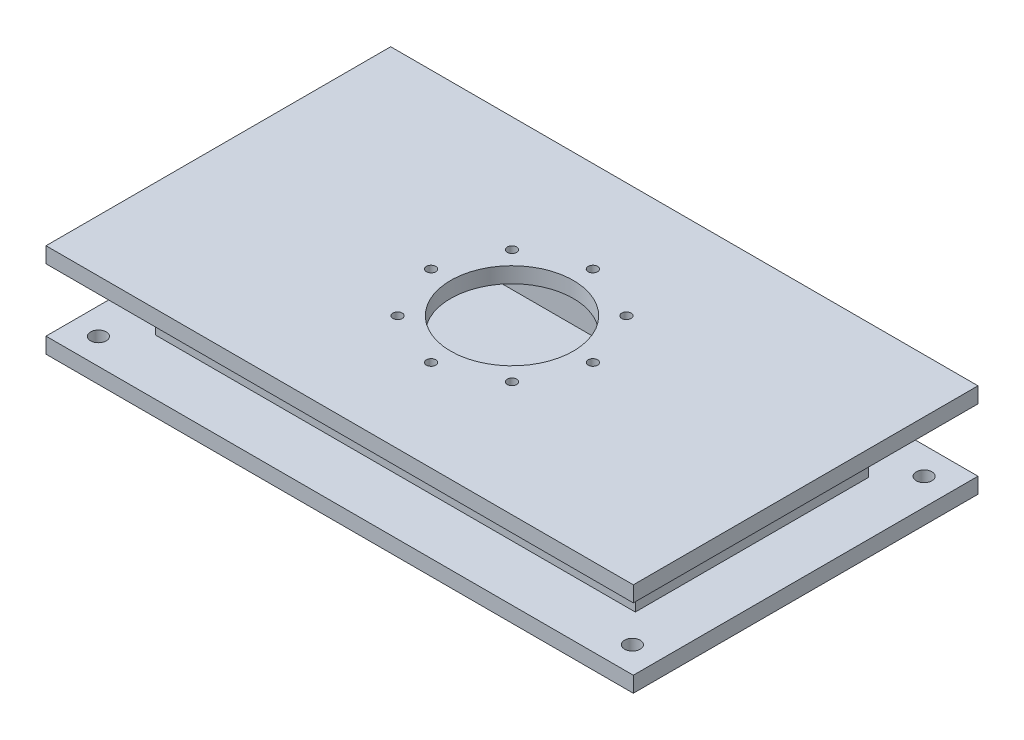
ISO-10303-21;
HEADER;
FILE_DESCRIPTION(('STEP AP214'),'2;1');
FILE_NAME('part.step','',(''),(''),'','','');
FILE_SCHEMA(('AUTOMOTIVE_DESIGN { 1 0 10303 214 1 1 1 1 }'));
ENDSEC;
DATA;
#1=APPLICATION_CONTEXT('core data for automotive mechanical design processes');
#2=APPLICATION_PROTOCOL_DEFINITION('international standard','automotive_design',2000,#1);
#3=PRODUCT_CONTEXT('',#1,'mechanical');
#4=PRODUCT('Part','Part','',(#3));
#5=PRODUCT_RELATED_PRODUCT_CATEGORY('part','',(#4));
#6=PRODUCT_DEFINITION_FORMATION('','',#4);
#7=PRODUCT_DEFINITION_CONTEXT('part definition',#1,'design');
#8=PRODUCT_DEFINITION('design','',#6,#7);
#9=PRODUCT_DEFINITION_SHAPE('','',#8);
#10=(LENGTH_UNIT() NAMED_UNIT(*) SI_UNIT(.MILLI.,.METRE.));
#11=(NAMED_UNIT(*) PLANE_ANGLE_UNIT() SI_UNIT($,.RADIAN.));
#12=(NAMED_UNIT(*) SI_UNIT($,.STERADIAN.) SOLID_ANGLE_UNIT());
#13=UNCERTAINTY_MEASURE_WITH_UNIT(LENGTH_MEASURE(1.E-05),#10,'distance_accuracy_value','');
#14=(GEOMETRIC_REPRESENTATION_CONTEXT(3) GLOBAL_UNCERTAINTY_ASSIGNED_CONTEXT((#13)) GLOBAL_UNIT_ASSIGNED_CONTEXT((#10,
#11,#12)) REPRESENTATION_CONTEXT('',''));
#15=CARTESIAN_POINT('',(0.,0.,0.));
#16=DIRECTION('',(0.,0.,1.));
#17=DIRECTION('',(1.,0.,0.));
#18=AXIS2_PLACEMENT_3D('',#15,#16,#17);
#19=CARTESIAN_POINT('',(0.,3.,0.));
#20=DIRECTION('',(0.,1.,0.));
#21=DIRECTION('',(0.,0.,1.));
#22=AXIS2_PLACEMENT_3D('',#19,#20,#21);
#23=PLANE('',#22);
#24=DIRECTION('',(0.,0.,1.));
#25=VECTOR('',#24,1.);
#26=CARTESIAN_POINT('',(-40.9820167865707,3.,-15.236345323741));
#27=LINE('',#26,#25);
#28=CARTESIAN_POINT('',(-40.9820167865707,3.,-15.236345323741));
#29=VERTEX_POINT('',#28);
#30=CARTESIAN_POINT('',(-40.9820167865707,3.,29.467654676259));
#31=VERTEX_POINT('',#30);
#32=EDGE_CURVE('E57',#29,#31,#27,.T.);
#33=ORIENTED_EDGE('',*,*,#32,.F.);
#34=DIRECTION('',(1.,0.,0.));
#35=VECTOR('',#34,1.);
#36=CARTESIAN_POINT('',(-40.9820167865707,3.,-15.236345323741));
#37=LINE('',#36,#35);
#38=CARTESIAN_POINT('',(50.9659832134293,3.,-15.236345323741));
#39=VERTEX_POINT('',#38);
#40=EDGE_CURVE('E64',#29,#39,#37,.T.);
#41=ORIENTED_EDGE('',*,*,#40,.T.);
#42=DIRECTION('',(0.,0.,1.));
#43=VECTOR('',#42,1.);
#44=CARTESIAN_POINT('',(50.9659832134293,3.,-15.236345323741));
#45=LINE('',#44,#43);
#46=CARTESIAN_POINT('',(50.9659832134293,3.,29.467654676259));
#47=VERTEX_POINT('',#46);
#48=EDGE_CURVE('E239',#39,#47,#45,.T.);
#49=ORIENTED_EDGE('',*,*,#48,.T.);
#50=DIRECTION('',(1.,0.,0.));
#51=VECTOR('',#50,1.);
#52=CARTESIAN_POINT('',(-40.9820167865707,3.,29.467654676259));
#53=LINE('',#52,#51);
#54=EDGE_CURVE('E237',#31,#47,#53,.T.);
#55=ORIENTED_EDGE('',*,*,#54,.F.);
#56=EDGE_LOOP('',(#33,#41,#49,#55));
#57=FACE_BOUND('',#56,.T.);
#58=CARTESIAN_POINT('',(56.1003672610243,3.,-20.7265189265204));
#59=DIRECTION('',(0.,1.,0.));
#60=DIRECTION('',(0.,0.,1.));
#61=AXIS2_PLACEMENT_3D('',#58,#59,#60);
#62=CIRCLE('',#61,1.5);
#63=CARTESIAN_POINT('',(56.1003672610243,3.,-19.2265189265204));
#64=VERTEX_POINT('',#63);
#65=EDGE_CURVE('E256',#64,#64,#62,.T.);
#66=ORIENTED_EDGE('',*,*,#65,.F.);
#67=EDGE_LOOP('',(#66));
#68=FACE_BOUND('',#67,.T.);
#69=CARTESIAN_POINT('',(-46.2077417648702,3.,-20.7265189265204));
#70=DIRECTION('',(0.,1.,0.));
#71=DIRECTION('',(0.,0.,1.));
#72=AXIS2_PLACEMENT_3D('',#69,#70,#71);
#73=CIRCLE('',#72,1.5);
#74=CARTESIAN_POINT('',(-46.2077417648702,3.,-19.2265189265204));
#75=VERTEX_POINT('',#74);
#76=EDGE_CURVE('E269',#75,#75,#73,.T.);
#77=ORIENTED_EDGE('',*,*,#76,.F.);
#78=EDGE_LOOP('',(#77));
#79=FACE_BOUND('',#78,.T.);
#80=DIRECTION('',(0.,0.,1.));
#81=VECTOR('',#80,1.);
#82=CARTESIAN_POINT('',(-51.2690167865707,3.,-25.904345323741));
#83=LINE('',#82,#81);
#84=CARTESIAN_POINT('',(-51.2690167865707,3.,-25.904345323741));
#85=VERTEX_POINT('',#84);
#86=CARTESIAN_POINT('',(-51.2690167865707,3.,40.135654676259));
#87=VERTEX_POINT('',#86);
#88=EDGE_CURVE('E277',#85,#87,#83,.T.);
#89=ORIENTED_EDGE('',*,*,#88,.T.);
#90=DIRECTION('',(1.,0.,0.));
#91=VECTOR('',#90,1.);
#92=CARTESIAN_POINT('',(-51.2690167865707,3.,40.135654676259));
#93=LINE('',#92,#91);
#94=CARTESIAN_POINT('',(61.2529832134293,3.,40.135654676259));
#95=VERTEX_POINT('',#94);
#96=EDGE_CURVE('E276',#87,#95,#93,.T.);
#97=ORIENTED_EDGE('',*,*,#96,.T.);
#98=DIRECTION('',(0.,0.,-1.));
#99=VECTOR('',#98,1.);
#100=CARTESIAN_POINT('',(61.2529832134293,3.,-25.904345323741));
#101=LINE('',#100,#99);
#102=CARTESIAN_POINT('',(61.2529832134293,3.,-25.904345323741));
#103=VERTEX_POINT('',#102);
#104=EDGE_CURVE('E281',#95,#103,#101,.T.);
#105=ORIENTED_EDGE('',*,*,#104,.T.);
#106=DIRECTION('',(-1.,0.,0.));
#107=VECTOR('',#106,1.);
#108=CARTESIAN_POINT('',(-51.2690167865707,3.,-25.904345323741));
#109=LINE('',#108,#107);
#110=EDGE_CURVE('E283',#103,#85,#109,.T.);
#111=ORIENTED_EDGE('',*,*,#110,.T.);
#112=EDGE_LOOP('',(#89,#97,#105,#111));
#113=FACE_BOUND('',#112,.T.);
#114=CARTESIAN_POINT('',(56.1003672610243,3.,35.1559236985098));
#115=DIRECTION('',(0.,1.,0.));
#116=DIRECTION('',(0.,0.,1.));
#117=AXIS2_PLACEMENT_3D('',#114,#115,#116);
#118=CIRCLE('',#117,1.5);
#119=CARTESIAN_POINT('',(56.1003672610243,3.,36.6559236985098));
#120=VERTEX_POINT('',#119);
#121=EDGE_CURVE('E262',#120,#120,#118,.T.);
#122=ORIENTED_EDGE('',*,*,#121,.F.);
#123=EDGE_LOOP('',(#122));
#124=FACE_BOUND('',#123,.T.);
#125=CARTESIAN_POINT('',(-46.2077417648702,3.,35.1559236985098));
#126=DIRECTION('',(0.,1.,0.));
#127=DIRECTION('',(0.,0.,1.));
#128=AXIS2_PLACEMENT_3D('',#125,#126,#127);
#129=CIRCLE('',#128,1.5);
#130=CARTESIAN_POINT('',(-46.2077417648702,3.,36.6559236985098));
#131=VERTEX_POINT('',#130);
#132=EDGE_CURVE('E252',#131,#131,#129,.T.);
#133=ORIENTED_EDGE('',*,*,#132,.F.);
#134=EDGE_LOOP('',(#133));
#135=FACE_BOUND('',#134,.T.);
#136=ADVANCED_FACE('F39',(#57,#68,#79,#113,#124,#135),#23,.T.);
#137=CARTESIAN_POINT('',(0.,0.,0.));
#138=DIRECTION('',(0.,1.,0.));
#139=DIRECTION('',(0.,0.,1.));
#140=AXIS2_PLACEMENT_3D('',#137,#138,#139);
#141=PLANE('',#140);
#142=DIRECTION('',(0.,0.,1.));
#143=VECTOR('',#142,1.);
#144=CARTESIAN_POINT('',(-51.2690167865707,0.,-25.904345323741));
#145=LINE('',#144,#143);
#146=CARTESIAN_POINT('',(-51.2690167865707,0.,-25.904345323741));
#147=VERTEX_POINT('',#146);
#148=CARTESIAN_POINT('',(-51.2690167865707,0.,40.135654676259));
#149=VERTEX_POINT('',#148);
#150=EDGE_CURVE('E272',#147,#149,#145,.T.);
#151=ORIENTED_EDGE('',*,*,#150,.F.);
#152=DIRECTION('',(-1.,0.,0.));
#153=VECTOR('',#152,1.);
#154=CARTESIAN_POINT('',(-51.2690167865707,0.,-25.904345323741));
#155=LINE('',#154,#153);
#156=CARTESIAN_POINT('',(61.2529832134293,0.,-25.904345323741));
#157=VERTEX_POINT('',#156);
#158=EDGE_CURVE('E278',#157,#147,#155,.T.);
#159=ORIENTED_EDGE('',*,*,#158,.F.);
#160=DIRECTION('',(0.,0.,-1.));
#161=VECTOR('',#160,1.);
#162=CARTESIAN_POINT('',(61.2529832134293,0.,-25.904345323741));
#163=LINE('',#162,#161);
#164=CARTESIAN_POINT('',(61.2529832134293,0.,40.135654676259));
#165=VERTEX_POINT('',#164);
#166=EDGE_CURVE('E292',#165,#157,#163,.T.);
#167=ORIENTED_EDGE('',*,*,#166,.F.);
#168=DIRECTION('',(1.,0.,0.));
#169=VECTOR('',#168,1.);
#170=CARTESIAN_POINT('',(-51.2690167865707,0.,40.135654676259));
#171=LINE('',#170,#169);
#172=EDGE_CURVE('E289',#149,#165,#171,.T.);
#173=ORIENTED_EDGE('',*,*,#172,.F.);
#174=EDGE_LOOP('',(#151,#159,#167,#173));
#175=FACE_BOUND('',#174,.T.);
#176=CARTESIAN_POINT('',(-46.2077417648702,0.,-20.7265189265204));
#177=DIRECTION('',(0.,1.,0.));
#178=DIRECTION('',(0.,0.,1.));
#179=AXIS2_PLACEMENT_3D('',#176,#177,#178);
#180=CIRCLE('',#179,1.5);
#181=CARTESIAN_POINT('',(-46.2077417648702,0.,-19.2265189265204));
#182=VERTEX_POINT('',#181);
#183=EDGE_CURVE('E270',#182,#182,#180,.T.);
#184=ORIENTED_EDGE('',*,*,#183,.T.);
#185=EDGE_LOOP('',(#184));
#186=FACE_BOUND('',#185,.T.);
#187=CARTESIAN_POINT('',(56.1003672610243,0.,35.1559236985098));
#188=DIRECTION('',(0.,1.,0.));
#189=DIRECTION('',(0.,0.,1.));
#190=AXIS2_PLACEMENT_3D('',#187,#188,#189);
#191=CIRCLE('',#190,1.5);
#192=CARTESIAN_POINT('',(56.1003672610243,0.,36.6559236985098));
#193=VERTEX_POINT('',#192);
#194=EDGE_CURVE('E261',#193,#193,#191,.T.);
#195=ORIENTED_EDGE('',*,*,#194,.T.);
#196=EDGE_LOOP('',(#195));
#197=FACE_BOUND('',#196,.T.);
#198=CARTESIAN_POINT('',(56.1003672610243,0.,-20.7265189265204));
#199=DIRECTION('',(0.,1.,0.));
#200=DIRECTION('',(0.,0.,1.));
#201=AXIS2_PLACEMENT_3D('',#198,#199,#200);
#202=CIRCLE('',#201,1.5);
#203=CARTESIAN_POINT('',(56.1003672610243,0.,-19.2265189265204));
#204=VERTEX_POINT('',#203);
#205=EDGE_CURVE('E254',#204,#204,#202,.T.);
#206=ORIENTED_EDGE('',*,*,#205,.T.);
#207=EDGE_LOOP('',(#206));
#208=FACE_BOUND('',#207,.T.);
#209=CARTESIAN_POINT('',(-46.2077417648702,0.,35.1559236985098));
#210=DIRECTION('',(0.,1.,0.));
#211=DIRECTION('',(0.,0.,1.));
#212=AXIS2_PLACEMENT_3D('',#209,#210,#211);
#213=CIRCLE('',#212,1.5);
#214=CARTESIAN_POINT('',(-46.2077417648702,0.,36.6559236985098));
#215=VERTEX_POINT('',#214);
#216=EDGE_CURVE('E253',#215,#215,#213,.T.);
#217=ORIENTED_EDGE('',*,*,#216,.T.);
#218=EDGE_LOOP('',(#217));
#219=FACE_BOUND('',#218,.T.);
#220=ADVANCED_FACE('F337',(#175,#186,#197,#208,#219),#141,.F.);
#221=CARTESIAN_POINT('',(-51.2690167865707,3.,-25.904345323741));
#222=DIRECTION('',(1.,0.,0.));
#223=DIRECTION('',(0.,0.,-1.));
#224=AXIS2_PLACEMENT_3D('',#221,#222,#223);
#225=PLANE('',#224);
#226=ORIENTED_EDGE('',*,*,#150,.T.);
#227=DIRECTION('',(0.,-1.,0.));
#228=VECTOR('',#227,1.);
#229=CARTESIAN_POINT('',(-51.2690167865707,3.,40.135654676259));
#230=LINE('',#229,#228);
#231=EDGE_CURVE('E11',#87,#149,#230,.T.);
#232=ORIENTED_EDGE('',*,*,#231,.F.);
#233=ORIENTED_EDGE('',*,*,#88,.F.);
#234=DIRECTION('',(0.,-1.,0.));
#235=VECTOR('',#234,1.);
#236=CARTESIAN_POINT('',(-51.2690167865707,3.,-25.904345323741));
#237=LINE('',#236,#235);
#238=EDGE_CURVE('E287',#85,#147,#237,.T.);
#239=ORIENTED_EDGE('',*,*,#238,.T.);
#240=EDGE_LOOP('',(#226,#232,#233,#239));
#241=FACE_BOUND('',#240,.T.);
#242=ADVANCED_FACE('F41',(#241),#225,.F.);
#243=CARTESIAN_POINT('',(-51.2690167865707,3.,40.135654676259));
#244=DIRECTION('',(0.,0.,-1.));
#245=DIRECTION('',(-1.,0.,0.));
#246=AXIS2_PLACEMENT_3D('',#243,#244,#245);
#247=PLANE('',#246);
#248=ORIENTED_EDGE('',*,*,#172,.T.);
#249=DIRECTION('',(0.,-1.,0.));
#250=VECTOR('',#249,1.);
#251=CARTESIAN_POINT('',(61.2529832134293,3.,40.135654676259));
#252=LINE('',#251,#250);
#253=EDGE_CURVE('E48',#95,#165,#252,.T.);
#254=ORIENTED_EDGE('',*,*,#253,.F.);
#255=ORIENTED_EDGE('',*,*,#96,.F.);
#256=ORIENTED_EDGE('',*,*,#231,.T.);
#257=EDGE_LOOP('',(#248,#254,#255,#256));
#258=FACE_BOUND('',#257,.T.);
#259=ADVANCED_FACE('F356',(#258),#247,.F.);
#260=CARTESIAN_POINT('',(61.2529832134293,3.,-25.904345323741));
#261=DIRECTION('',(-1.,0.,0.));
#262=DIRECTION('',(0.,0.,1.));
#263=AXIS2_PLACEMENT_3D('',#260,#261,#262);
#264=PLANE('',#263);
#265=ORIENTED_EDGE('',*,*,#166,.T.);
#266=DIRECTION('',(0.,-1.,0.));
#267=VECTOR('',#266,1.);
#268=CARTESIAN_POINT('',(61.2529832134293,3.,-25.904345323741));
#269=LINE('',#268,#267);
#270=EDGE_CURVE('E299',#103,#157,#269,.T.);
#271=ORIENTED_EDGE('',*,*,#270,.F.);
#272=ORIENTED_EDGE('',*,*,#104,.F.);
#273=ORIENTED_EDGE('',*,*,#253,.T.);
#274=EDGE_LOOP('',(#265,#271,#272,#273));
#275=FACE_BOUND('',#274,.T.);
#276=ADVANCED_FACE('F360',(#275),#264,.F.);
#277=CARTESIAN_POINT('',(-51.2690167865707,3.,-25.904345323741));
#278=DIRECTION('',(0.,0.,1.));
#279=DIRECTION('',(1.,0.,0.));
#280=AXIS2_PLACEMENT_3D('',#277,#278,#279);
#281=PLANE('',#280);
#282=ORIENTED_EDGE('',*,*,#158,.T.);
#283=ORIENTED_EDGE('',*,*,#238,.F.);
#284=ORIENTED_EDGE('',*,*,#110,.F.);
#285=ORIENTED_EDGE('',*,*,#270,.T.);
#286=EDGE_LOOP('',(#282,#283,#284,#285));
#287=FACE_BOUND('',#286,.T.);
#288=ADVANCED_FACE('F353',(#287),#281,.F.);
#289=CARTESIAN_POINT('',(-46.2077417648702,3.,-20.7265189265204));
#290=DIRECTION('',(0.,-1.,0.));
#291=DIRECTION('',(0.,0.,-1.));
#292=AXIS2_PLACEMENT_3D('',#289,#290,#291);
#293=CYLINDRICAL_SURFACE('',#292,1.5);
#294=ORIENTED_EDGE('',*,*,#76,.T.);
#295=EDGE_LOOP('',(#294));
#296=FACE_BOUND('',#295,.T.);
#297=ORIENTED_EDGE('',*,*,#183,.F.);
#298=EDGE_LOOP('',(#297));
#299=FACE_BOUND('',#298,.T.);
#300=ADVANCED_FACE('F354',(#296,#299),#293,.F.);
#301=CARTESIAN_POINT('',(56.1003672610243,3.,35.1559236985098));
#302=DIRECTION('',(0.,-1.,0.));
#303=DIRECTION('',(0.,0.,-1.));
#304=AXIS2_PLACEMENT_3D('',#301,#302,#303);
#305=CYLINDRICAL_SURFACE('',#304,1.5);
#306=ORIENTED_EDGE('',*,*,#121,.T.);
#307=EDGE_LOOP('',(#306));
#308=FACE_BOUND('',#307,.T.);
#309=ORIENTED_EDGE('',*,*,#194,.F.);
#310=EDGE_LOOP('',(#309));
#311=FACE_BOUND('',#310,.T.);
#312=ADVANCED_FACE('F399',(#308,#311),#305,.F.);
#313=CARTESIAN_POINT('',(56.1003672610243,3.,-20.7265189265204));
#314=DIRECTION('',(0.,-1.,0.));
#315=DIRECTION('',(0.,0.,-1.));
#316=AXIS2_PLACEMENT_3D('',#313,#314,#315);
#317=CYLINDRICAL_SURFACE('',#316,1.5);
#318=ORIENTED_EDGE('',*,*,#65,.T.);
#319=EDGE_LOOP('',(#318));
#320=FACE_BOUND('',#319,.T.);
#321=ORIENTED_EDGE('',*,*,#205,.F.);
#322=EDGE_LOOP('',(#321));
#323=FACE_BOUND('',#322,.T.);
#324=ADVANCED_FACE('F389',(#320,#323),#317,.F.);
#325=CARTESIAN_POINT('',(-46.2077417648702,3.,35.1559236985098));
#326=DIRECTION('',(0.,-1.,0.));
#327=DIRECTION('',(0.,0.,-1.));
#328=AXIS2_PLACEMENT_3D('',#325,#326,#327);
#329=CYLINDRICAL_SURFACE('',#328,1.5);
#330=ORIENTED_EDGE('',*,*,#132,.T.);
#331=EDGE_LOOP('',(#330));
#332=FACE_BOUND('',#331,.T.);
#333=ORIENTED_EDGE('',*,*,#216,.F.);
#334=EDGE_LOOP('',(#333));
#335=FACE_BOUND('',#334,.T.);
#336=ADVANCED_FACE('F384',(#332,#335),#329,.F.);
#337=CARTESIAN_POINT('',(-40.9820167865707,15.,-15.236345323741));
#338=DIRECTION('',(1.,0.,0.));
#339=DIRECTION('',(0.,0.,-1.));
#340=AXIS2_PLACEMENT_3D('',#337,#338,#339);
#341=PLANE('',#340);
#342=CARTESIAN_POINT('',(-40.9820167865707,8.19742761136061,-6.69341202867461));
#343=DIRECTION('',(-1.,0.,0.));
#344=DIRECTION('',(0.,0.,1.));
#345=AXIS2_PLACEMENT_3D('',#342,#343,#344);
#346=CIRCLE('',#345,3.39382923358218);
#347=CARTESIAN_POINT('',(-40.9820167865707,8.19742761136061,-3.29958279509243));
#348=VERTEX_POINT('',#347);
#349=EDGE_CURVE('E179',#348,#348,#346,.T.);
#350=ORIENTED_EDGE('',*,*,#349,.F.);
#351=EDGE_LOOP('',(#350));
#352=FACE_BOUND('',#351,.T.);
#353=ORIENTED_EDGE('',*,*,#32,.T.);
#354=DIRECTION('',(0.,-1.,0.));
#355=VECTOR('',#354,1.);
#356=CARTESIAN_POINT('',(-40.9820167865707,15.,29.467654676259));
#357=LINE('',#356,#355);
#358=CARTESIAN_POINT('',(-40.9820167865707,15.,29.467654676259));
#359=VERTEX_POINT('',#358);
#360=EDGE_CURVE('E248',#359,#31,#357,.T.);
#361=ORIENTED_EDGE('',*,*,#360,.F.);
#362=DIRECTION('',(0.,0.,1.));
#363=VECTOR('',#362,1.);
#364=CARTESIAN_POINT('',(-40.9820167865707,15.,-15.236345323741));
#365=LINE('',#364,#363);
#366=CARTESIAN_POINT('',(-40.9820167865707,15.,-15.236345323741));
#367=VERTEX_POINT('',#366);
#368=EDGE_CURVE('E221',#367,#359,#365,.T.);
#369=ORIENTED_EDGE('',*,*,#368,.F.);
#370=DIRECTION('',(0.,-1.,0.));
#371=VECTOR('',#370,1.);
#372=CARTESIAN_POINT('',(-40.9820167865707,15.,-15.236345323741));
#373=LINE('',#372,#371);
#374=EDGE_CURVE('E234',#367,#29,#373,.T.);
#375=ORIENTED_EDGE('',*,*,#374,.T.);
#376=EDGE_LOOP('',(#353,#361,#369,#375));
#377=FACE_BOUND('',#376,.T.);
#378=ADVANCED_FACE('F390',(#352,#377),#341,.F.);
#379=CARTESIAN_POINT('',(-40.9820167865707,15.,29.467654676259));
#380=DIRECTION('',(0.,0.,-1.));
#381=DIRECTION('',(-1.,0.,0.));
#382=AXIS2_PLACEMENT_3D('',#379,#380,#381);
#383=PLANE('',#382);
#384=CARTESIAN_POINT('',(-28.8927842475601,9.11852717828765,29.467654676259));
#385=DIRECTION('',(0.,0.,1.));
#386=DIRECTION('',(1.,0.,0.));
#387=AXIS2_PLACEMENT_3D('',#384,#385,#386);
#388=CIRCLE('',#387,3.25340658543422);
#389=CARTESIAN_POINT('',(-25.6393776621259,9.11852717828765,29.467654676259));
#390=VERTEX_POINT('',#389);
#391=EDGE_CURVE('E186',#390,#390,#388,.T.);
#392=ORIENTED_EDGE('',*,*,#391,.F.);
#393=EDGE_LOOP('',(#392));
#394=FACE_BOUND('',#393,.T.);
#395=ORIENTED_EDGE('',*,*,#54,.T.);
#396=DIRECTION('',(0.,-1.,0.));
#397=VECTOR('',#396,1.);
#398=CARTESIAN_POINT('',(50.9659832134293,15.,29.467654676259));
#399=LINE('',#398,#397);
#400=CARTESIAN_POINT('',(50.9659832134293,15.,29.467654676259));
#401=VERTEX_POINT('',#400);
#402=EDGE_CURVE('E242',#401,#47,#399,.T.);
#403=ORIENTED_EDGE('',*,*,#402,.F.);
#404=DIRECTION('',(1.,0.,0.));
#405=VECTOR('',#404,1.);
#406=CARTESIAN_POINT('',(-40.9820167865707,15.,29.467654676259));
#407=LINE('',#406,#405);
#408=EDGE_CURVE('E229',#359,#401,#407,.T.);
#409=ORIENTED_EDGE('',*,*,#408,.F.);
#410=ORIENTED_EDGE('',*,*,#360,.T.);
#411=EDGE_LOOP('',(#395,#403,#409,#410));
#412=FACE_BOUND('',#411,.T.);
#413=ADVANCED_FACE('F397',(#394,#412),#383,.F.);
#414=CARTESIAN_POINT('',(50.9659832134293,15.,-15.236345323741));
#415=DIRECTION('',(1.,0.,0.));
#416=DIRECTION('',(0.,0.,-1.));
#417=AXIS2_PLACEMENT_3D('',#414,#415,#416);
#418=PLANE('',#417);
#419=ORIENTED_EDGE('',*,*,#48,.F.);
#420=DIRECTION('',(0.,-1.,0.));
#421=VECTOR('',#420,1.);
#422=CARTESIAN_POINT('',(50.9659832134293,15.,-15.236345323741));
#423=LINE('',#422,#421);
#424=CARTESIAN_POINT('',(50.9659832134293,15.,-15.236345323741));
#425=VERTEX_POINT('',#424);
#426=EDGE_CURVE('E245',#425,#39,#423,.T.);
#427=ORIENTED_EDGE('',*,*,#426,.F.);
#428=DIRECTION('',(0.,0.,1.));
#429=VECTOR('',#428,1.);
#430=CARTESIAN_POINT('',(50.9659832134293,15.,-15.236345323741));
#431=LINE('',#430,#429);
#432=EDGE_CURVE('E230',#425,#401,#431,.T.);
#433=ORIENTED_EDGE('',*,*,#432,.T.);
#434=ORIENTED_EDGE('',*,*,#402,.T.);
#435=EDGE_LOOP('',(#419,#427,#433,#434));
#436=FACE_BOUND('',#435,.T.);
#437=ADVANCED_FACE('F477',(#436),#418,.T.);
#438=CARTESIAN_POINT('',(-40.9820167865707,15.,-15.236345323741));
#439=DIRECTION('',(0.,0.,-1.));
#440=DIRECTION('',(-1.,0.,0.));
#441=AXIS2_PLACEMENT_3D('',#438,#439,#440);
#442=PLANE('',#441);
#443=ORIENTED_EDGE('',*,*,#40,.F.);
#444=ORIENTED_EDGE('',*,*,#374,.F.);
#445=DIRECTION('',(1.,0.,0.));
#446=VECTOR('',#445,1.);
#447=CARTESIAN_POINT('',(-40.9820167865707,15.,-15.236345323741));
#448=LINE('',#447,#446);
#449=EDGE_CURVE('E232',#367,#425,#448,.T.);
#450=ORIENTED_EDGE('',*,*,#449,.T.);
#451=ORIENTED_EDGE('',*,*,#426,.T.);
#452=EDGE_LOOP('',(#443,#444,#450,#451));
#453=FACE_BOUND('',#452,.T.);
#454=ADVANCED_FACE('F488',(#453),#442,.T.);
#455=CARTESIAN_POINT('',(0.,2.54,0.));
#456=DIRECTION('',(0.,1.,0.));
#457=DIRECTION('',(0.,0.,1.));
#458=AXIS2_PLACEMENT_3D('',#455,#456,#457);
#459=PLANE('',#458);
#460=DIRECTION('',(0.,0.,-1.));
#461=VECTOR('',#460,1.);
#462=CARTESIAN_POINT('',(48.4259832134293,2.54,0.));
#463=LINE('',#462,#461);
#464=CARTESIAN_POINT('',(48.4259832134293,2.54,26.927654676259));
#465=VERTEX_POINT('',#464);
#466=CARTESIAN_POINT('',(48.4259832134293,2.54,-12.696345323741));
#467=VERTEX_POINT('',#466);
#468=EDGE_CURVE('E217',#465,#467,#463,.T.);
#469=ORIENTED_EDGE('',*,*,#468,.T.);
#470=DIRECTION('',(-1.,0.,0.));
#471=VECTOR('',#470,1.);
#472=CARTESIAN_POINT('',(0.,2.54,-12.696345323741));
#473=LINE('',#472,#471);
#474=CARTESIAN_POINT('',(-38.4420167865707,2.54,-12.696345323741));
#475=VERTEX_POINT('',#474);
#476=EDGE_CURVE('E214',#467,#475,#473,.T.);
#477=ORIENTED_EDGE('',*,*,#476,.T.);
#478=DIRECTION('',(0.,0.,-1.));
#479=VECTOR('',#478,1.);
#480=CARTESIAN_POINT('',(-38.4420167865707,2.54,0.));
#481=LINE('',#480,#479);
#482=CARTESIAN_POINT('',(-38.4420167865707,2.54,26.927654676259));
#483=VERTEX_POINT('',#482);
#484=EDGE_CURVE('E194',#483,#475,#481,.T.);
#485=ORIENTED_EDGE('',*,*,#484,.F.);
#486=DIRECTION('',(-1.,0.,0.));
#487=VECTOR('',#486,1.);
#488=CARTESIAN_POINT('',(0.,2.54,26.927654676259));
#489=LINE('',#488,#487);
#490=EDGE_CURVE('E222',#465,#483,#489,.T.);
#491=ORIENTED_EDGE('',*,*,#490,.F.);
#492=EDGE_LOOP('',(#469,#477,#485,#491));
#493=FACE_BOUND('',#492,.T.);
#494=ADVANCED_FACE('F324',(#493),#459,.T.);
#495=CARTESIAN_POINT('',(-38.4420167865707,15.,-15.236345323741));
#496=DIRECTION('',(1.,0.,0.));
#497=DIRECTION('',(0.,0.,-1.));
#498=AXIS2_PLACEMENT_3D('',#495,#496,#497);
#499=PLANE('',#498);
#500=CARTESIAN_POINT('',(-38.4420167865707,8.19742761136061,-6.69341202867461));
#501=DIRECTION('',(1.,0.,0.));
#502=DIRECTION('',(0.,0.,-1.));
#503=AXIS2_PLACEMENT_3D('',#500,#501,#502);
#504=CIRCLE('',#503,3.39382923358218);
#505=CARTESIAN_POINT('',(-38.4420167865707,8.19742761136061,-10.0872412622568));
#506=VERTEX_POINT('',#505);
#507=EDGE_CURVE('E43',#506,#506,#504,.T.);
#508=ORIENTED_EDGE('',*,*,#507,.F.);
#509=EDGE_LOOP('',(#508));
#510=FACE_BOUND('',#509,.T.);
#511=ORIENTED_EDGE('',*,*,#484,.T.);
#512=DIRECTION('',(0.,-1.,0.));
#513=VECTOR('',#512,1.);
#514=CARTESIAN_POINT('',(-38.4420167865707,15.,-12.696345323741));
#515=LINE('',#514,#513);
#516=CARTESIAN_POINT('',(-38.4420167865707,15.,-12.696345323741));
#517=VERTEX_POINT('',#516);
#518=EDGE_CURVE('E198',#517,#475,#515,.T.);
#519=ORIENTED_EDGE('',*,*,#518,.F.);
#520=DIRECTION('',(0.,0.,1.));
#521=VECTOR('',#520,1.);
#522=CARTESIAN_POINT('',(-38.4420167865707,15.,-15.236345323741));
#523=LINE('',#522,#521);
#524=CARTESIAN_POINT('',(-38.4420167865707,15.,26.927654676259));
#525=VERTEX_POINT('',#524);
#526=EDGE_CURVE('E202',#517,#525,#523,.T.);
#527=ORIENTED_EDGE('',*,*,#526,.T.);
#528=DIRECTION('',(0.,-1.,0.));
#529=VECTOR('',#528,1.);
#530=CARTESIAN_POINT('',(-38.4420167865707,15.,26.927654676259));
#531=LINE('',#530,#529);
#532=EDGE_CURVE('E192',#525,#483,#531,.T.);
#533=ORIENTED_EDGE('',*,*,#532,.T.);
#534=EDGE_LOOP('',(#511,#519,#527,#533));
#535=FACE_BOUND('',#534,.T.);
#536=ADVANCED_FACE('F309',(#510,#535),#499,.T.);
#537=CARTESIAN_POINT('',(-40.9820167865707,15.,26.927654676259));
#538=DIRECTION('',(0.,0.,-1.));
#539=DIRECTION('',(-1.,0.,0.));
#540=AXIS2_PLACEMENT_3D('',#537,#538,#539);
#541=PLANE('',#540);
#542=CARTESIAN_POINT('',(-28.8927842475601,9.11852717828765,26.927654676259));
#543=DIRECTION('',(0.,0.,-1.));
#544=DIRECTION('',(-1.,0.,0.));
#545=AXIS2_PLACEMENT_3D('',#542,#543,#544);
#546=CIRCLE('',#545,3.25340658543422);
#547=CARTESIAN_POINT('',(-32.1461908329944,9.11852717828765,26.927654676259));
#548=VERTEX_POINT('',#547);
#549=EDGE_CURVE('E187',#548,#548,#546,.T.);
#550=ORIENTED_EDGE('',*,*,#549,.F.);
#551=EDGE_LOOP('',(#550));
#552=FACE_BOUND('',#551,.T.);
#553=ORIENTED_EDGE('',*,*,#490,.T.);
#554=ORIENTED_EDGE('',*,*,#532,.F.);
#555=DIRECTION('',(1.,0.,0.));
#556=VECTOR('',#555,1.);
#557=CARTESIAN_POINT('',(-40.9820167865707,15.,26.927654676259));
#558=LINE('',#557,#556);
#559=CARTESIAN_POINT('',(48.4259832134293,15.,26.927654676259));
#560=VERTEX_POINT('',#559);
#561=EDGE_CURVE('E208',#525,#560,#558,.T.);
#562=ORIENTED_EDGE('',*,*,#561,.T.);
#563=DIRECTION('',(0.,-1.,0.));
#564=VECTOR('',#563,1.);
#565=CARTESIAN_POINT('',(48.4259832134293,15.,26.927654676259));
#566=LINE('',#565,#564);
#567=EDGE_CURVE('E191',#560,#465,#566,.T.);
#568=ORIENTED_EDGE('',*,*,#567,.T.);
#569=EDGE_LOOP('',(#553,#554,#562,#568));
#570=FACE_BOUND('',#569,.T.);
#571=ADVANCED_FACE('F308',(#552,#570),#541,.T.);
#572=CARTESIAN_POINT('',(48.4259832134293,15.,-15.236345323741));
#573=DIRECTION('',(1.,0.,0.));
#574=DIRECTION('',(0.,0.,-1.));
#575=AXIS2_PLACEMENT_3D('',#572,#573,#574);
#576=PLANE('',#575);
#577=ORIENTED_EDGE('',*,*,#567,.F.);
#578=DIRECTION('',(0.,0.,1.));
#579=VECTOR('',#578,1.);
#580=CARTESIAN_POINT('',(48.4259832134293,15.,-15.236345323741));
#581=LINE('',#580,#579);
#582=CARTESIAN_POINT('',(48.4259832134293,15.,-12.696345323741));
#583=VERTEX_POINT('',#582);
#584=EDGE_CURVE('E211',#583,#560,#581,.T.);
#585=ORIENTED_EDGE('',*,*,#584,.F.);
#586=DIRECTION('',(0.,-1.,0.));
#587=VECTOR('',#586,1.);
#588=CARTESIAN_POINT('',(48.4259832134293,15.,-12.696345323741));
#589=LINE('',#588,#587);
#590=EDGE_CURVE('E200',#583,#467,#589,.T.);
#591=ORIENTED_EDGE('',*,*,#590,.T.);
#592=ORIENTED_EDGE('',*,*,#468,.F.);
#593=EDGE_LOOP('',(#577,#585,#591,#592));
#594=FACE_BOUND('',#593,.T.);
#595=ADVANCED_FACE('F310',(#594),#576,.F.);
#596=CARTESIAN_POINT('',(-40.9820167865707,15.,-12.696345323741));
#597=DIRECTION('',(0.,0.,-1.));
#598=DIRECTION('',(-1.,0.,0.));
#599=AXIS2_PLACEMENT_3D('',#596,#597,#598);
#600=PLANE('',#599);
#601=ORIENTED_EDGE('',*,*,#590,.F.);
#602=DIRECTION('',(1.,0.,0.));
#603=VECTOR('',#602,1.);
#604=CARTESIAN_POINT('',(-40.9820167865707,15.,-12.696345323741));
#605=LINE('',#604,#603);
#606=EDGE_CURVE('E199',#517,#583,#605,.T.);
#607=ORIENTED_EDGE('',*,*,#606,.F.);
#608=ORIENTED_EDGE('',*,*,#518,.T.);
#609=ORIENTED_EDGE('',*,*,#476,.F.);
#610=EDGE_LOOP('',(#601,#607,#608,#609));
#611=FACE_BOUND('',#610,.T.);
#612=ADVANCED_FACE('F330',(#611),#600,.F.);
#613=CARTESIAN_POINT('',(-28.8927842475601,9.11852717828765,21.277654676259));
#614=DIRECTION('',(0.,0.,1.));
#615=DIRECTION('',(1.,0.,0.));
#616=AXIS2_PLACEMENT_3D('',#613,#614,#615);
#617=CYLINDRICAL_SURFACE('',#616,3.25340658543422);
#618=ORIENTED_EDGE('',*,*,#549,.T.);
#619=EDGE_LOOP('',(#618));
#620=FACE_BOUND('',#619,.T.);
#621=ORIENTED_EDGE('',*,*,#391,.T.);
#622=EDGE_LOOP('',(#621));
#623=FACE_BOUND('',#622,.T.);
#624=ADVANCED_FACE('F303',(#620,#623),#617,.F.);
#625=CARTESIAN_POINT('',(-32.7920167865707,8.19742761136061,-6.69341202867461));
#626=DIRECTION('',(-1.,0.,0.));
#627=DIRECTION('',(0.,0.,1.));
#628=AXIS2_PLACEMENT_3D('',#625,#626,#627);
#629=CYLINDRICAL_SURFACE('',#628,3.39382923358218);
#630=ORIENTED_EDGE('',*,*,#507,.T.);
#631=EDGE_LOOP('',(#630));
#632=FACE_BOUND('',#631,.T.);
#633=ORIENTED_EDGE('',*,*,#349,.T.);
#634=EDGE_LOOP('',(#633));
#635=FACE_BOUND('',#634,.T.);
#636=ADVANCED_FACE('F333',(#632,#635),#629,.F.);
#637=CARTESIAN_POINT('',(0.,15.,0.));
#638=DIRECTION('',(0.,1.,0.));
#639=DIRECTION('',(0.,0.,1.));
#640=AXIS2_PLACEMENT_3D('',#637,#638,#639);
#641=PLANE('',#640);
#642=DIRECTION('',(0.,0.,1.));
#643=VECTOR('',#642,1.);
#644=CARTESIAN_POINT('',(-51.2690167865707,15.,-25.904345323741));
#645=LINE('',#644,#643);
#646=CARTESIAN_POINT('',(-51.2690167865707,15.,-25.904345323741));
#647=VERTEX_POINT('',#646);
#648=CARTESIAN_POINT('',(-51.2690167865707,15.,40.135654676259));
#649=VERTEX_POINT('',#648);
#650=EDGE_CURVE('E178',#647,#649,#645,.T.);
#651=ORIENTED_EDGE('',*,*,#650,.F.);
#652=DIRECTION('',(-1.,0.,0.));
#653=VECTOR('',#652,1.);
#654=CARTESIAN_POINT('',(-51.2690167865707,15.,-25.904345323741));
#655=LINE('',#654,#653);
#656=CARTESIAN_POINT('',(61.2529832134293,15.,-25.904345323741));
#657=VERTEX_POINT('',#656);
#658=EDGE_CURVE('E173',#657,#647,#655,.T.);
#659=ORIENTED_EDGE('',*,*,#658,.F.);
#660=DIRECTION('',(0.,0.,-1.));
#661=VECTOR('',#660,1.);
#662=CARTESIAN_POINT('',(61.2529832134293,15.,-25.904345323741));
#663=LINE('',#662,#661);
#664=CARTESIAN_POINT('',(61.2529832134293,15.,40.135654676259));
#665=VERTEX_POINT('',#664);
#666=EDGE_CURVE('E756',#665,#657,#663,.T.);
#667=ORIENTED_EDGE('',*,*,#666,.F.);
#668=DIRECTION('',(1.,0.,0.));
#669=VECTOR('',#668,1.);
#670=CARTESIAN_POINT('',(-51.2690167865707,15.,40.135654676259));
#671=LINE('',#670,#669);
#672=EDGE_CURVE('E754',#649,#665,#671,.T.);
#673=ORIENTED_EDGE('',*,*,#672,.F.);
#674=EDGE_LOOP('',(#651,#659,#667,#673));
#675=FACE_BOUND('',#674,.T.);
#676=ORIENTED_EDGE('',*,*,#449,.F.);
#677=ORIENTED_EDGE('',*,*,#368,.T.);
#678=ORIENTED_EDGE('',*,*,#408,.T.);
#679=ORIENTED_EDGE('',*,*,#432,.F.);
#680=EDGE_LOOP('',(#676,#677,#678,#679));
#681=FACE_BOUND('',#680,.T.);
#682=ADVANCED_FACE('F540',(#675,#681),#641,.F.);
#683=CARTESIAN_POINT('',(0.,18.,0.));
#684=DIRECTION('',(0.,1.,0.));
#685=DIRECTION('',(0.,0.,1.));
#686=AXIS2_PLACEMENT_3D('',#683,#684,#685);
#687=PLANE('',#686);
#688=CARTESIAN_POINT('',(20.4919832134293,18.,7.115654676259));
#689=DIRECTION('',(0.,1.,0.));
#690=DIRECTION('',(0.,0.,1.));
#691=AXIS2_PLACEMENT_3D('',#688,#689,#690);
#692=CIRCLE('',#691,0.902882747034929);
#693=CARTESIAN_POINT('',(20.4919832134293,18.,8.01853742329393));
#694=VERTEX_POINT('',#693);
#695=EDGE_CURVE('E703',#694,#694,#692,.T.);
#696=ORIENTED_EDGE('',*,*,#695,.F.);
#697=EDGE_LOOP('',(#696));
#698=FACE_BOUND('',#697,.T.);
#699=CARTESIAN_POINT('',(4.99198321342926,18.,22.615654676259));
#700=DIRECTION('',(0.,1.,0.));
#701=DIRECTION('',(0.,0.,1.));
#702=AXIS2_PLACEMENT_3D('',#699,#700,#701);
#703=CIRCLE('',#702,0.902882747034708);
#704=CARTESIAN_POINT('',(4.99198321342926,18.,23.5185374232937));
#705=VERTEX_POINT('',#704);
#706=EDGE_CURVE('E714',#705,#705,#703,.T.);
#707=ORIENTED_EDGE('',*,*,#706,.F.);
#708=EDGE_LOOP('',(#707));
#709=FACE_BOUND('',#708,.T.);
#710=CARTESIAN_POINT('',(-10.5080167865705,18.,7.11565467625927));
#711=DIRECTION('',(0.,1.,0.));
#712=DIRECTION('',(0.,0.,1.));
#713=AXIS2_PLACEMENT_3D('',#710,#711,#712);
#714=CIRCLE('',#713,0.902882747035228);
#715=CARTESIAN_POINT('',(-10.5080167865705,18.,8.0185374232945));
#716=VERTEX_POINT('',#715);
#717=EDGE_CURVE('E730',#716,#716,#714,.T.);
#718=ORIENTED_EDGE('',*,*,#717,.F.);
#719=EDGE_LOOP('',(#718));
#720=FACE_BOUND('',#719,.T.);
#721=CARTESIAN_POINT('',(4.99198321342927,18.,-8.384345323741));
#722=DIRECTION('',(0.,1.,0.));
#723=DIRECTION('',(0.,0.,1.));
#724=AXIS2_PLACEMENT_3D('',#721,#722,#723);
#725=CIRCLE('',#724,0.902882747035227);
#726=CARTESIAN_POINT('',(4.99198321342927,18.,-7.48146257670577));
#727=VERTEX_POINT('',#726);
#728=EDGE_CURVE('E738',#727,#727,#725,.T.);
#729=ORIENTED_EDGE('',*,*,#728,.F.);
#730=EDGE_LOOP('',(#729));
#731=FACE_BOUND('',#730,.T.);
#732=DIRECTION('',(0.,0.,1.));
#733=VECTOR('',#732,1.);
#734=CARTESIAN_POINT('',(-51.2690167865707,18.,-25.904345323741));
#735=LINE('',#734,#733);
#736=CARTESIAN_POINT('',(-51.2690167865707,18.,-25.904345323741));
#737=VERTEX_POINT('',#736);
#738=CARTESIAN_POINT('',(-51.2690167865707,18.,40.135654676259));
#739=VERTEX_POINT('',#738);
#740=EDGE_CURVE('E163',#737,#739,#735,.T.);
#741=ORIENTED_EDGE('',*,*,#740,.T.);
#742=DIRECTION('',(1.,0.,0.));
#743=VECTOR('',#742,1.);
#744=CARTESIAN_POINT('',(-51.2690167865707,18.,40.135654676259));
#745=LINE('',#744,#743);
#746=CARTESIAN_POINT('',(61.2529832134293,18.,40.135654676259));
#747=VERTEX_POINT('',#746);
#748=EDGE_CURVE('E153',#739,#747,#745,.T.);
#749=ORIENTED_EDGE('',*,*,#748,.T.);
#750=DIRECTION('',(0.,0.,-1.));
#751=VECTOR('',#750,1.);
#752=CARTESIAN_POINT('',(61.2529832134293,18.,-25.904345323741));
#753=LINE('',#752,#751);
#754=CARTESIAN_POINT('',(61.2529832134293,18.,-25.904345323741));
#755=VERTEX_POINT('',#754);
#756=EDGE_CURVE('E162',#747,#755,#753,.T.);
#757=ORIENTED_EDGE('',*,*,#756,.T.);
#758=DIRECTION('',(-1.,0.,0.));
#759=VECTOR('',#758,1.);
#760=CARTESIAN_POINT('',(-51.2690167865707,18.,-25.904345323741));
#761=LINE('',#760,#759);
#762=EDGE_CURVE('E168',#755,#737,#761,.T.);
#763=ORIENTED_EDGE('',*,*,#762,.T.);
#764=EDGE_LOOP('',(#741,#749,#757,#763));
#765=FACE_BOUND('',#764,.T.);
#766=CARTESIAN_POINT('',(4.99198321342927,18.,7.115654676259));
#767=DIRECTION('',(0.,1.,0.));
#768=DIRECTION('',(0.,0.,1.));
#769=AXIS2_PLACEMENT_3D('',#766,#767,#768);
#770=CIRCLE('',#769,11.75);
#771=CARTESIAN_POINT('',(4.99198321342927,18.,18.865654676259));
#772=VERTEX_POINT('',#771);
#773=EDGE_CURVE('E741',#772,#772,#770,.T.);
#774=ORIENTED_EDGE('',*,*,#773,.F.);
#775=EDGE_LOOP('',(#774));
#776=FACE_BOUND('',#775,.T.);
#777=CARTESIAN_POINT('',(-5.96817189496218,18.,-3.84450043213231));
#778=DIRECTION('',(0.,1.,0.));
#779=DIRECTION('',(0.,0.,1.));
#780=AXIS2_PLACEMENT_3D('',#777,#778,#779);
#781=CIRCLE('',#780,0.902882747035227);
#782=CARTESIAN_POINT('',(-5.96817189496218,18.,-2.94161768509709));
#783=VERTEX_POINT('',#782);
#784=EDGE_CURVE('E731',#783,#783,#781,.T.);
#785=ORIENTED_EDGE('',*,*,#784,.F.);
#786=EDGE_LOOP('',(#785));
#787=FACE_BOUND('',#786,.T.);
#788=CARTESIAN_POINT('',(-5.96817189496222,18.,18.0758097846505));
#789=DIRECTION('',(0.,1.,0.));
#790=DIRECTION('',(0.,0.,1.));
#791=AXIS2_PLACEMENT_3D('',#788,#789,#790);
#792=CIRCLE('',#791,0.902882747034749);
#793=CARTESIAN_POINT('',(-5.96817189496222,18.,18.9786925316852));
#794=VERTEX_POINT('',#793);
#795=EDGE_CURVE('E724',#794,#794,#792,.T.);
#796=ORIENTED_EDGE('',*,*,#795,.F.);
#797=EDGE_LOOP('',(#796));
#798=FACE_BOUND('',#797,.T.);
#799=CARTESIAN_POINT('',(15.9521383218208,18.,18.0758097846505));
#800=DIRECTION('',(0.,1.,0.));
#801=DIRECTION('',(0.,0.,1.));
#802=AXIS2_PLACEMENT_3D('',#799,#800,#801);
#803=CIRCLE('',#802,0.902882747034788);
#804=CARTESIAN_POINT('',(15.9521383218208,18.,18.9786925316853));
#805=VERTEX_POINT('',#804);
#806=EDGE_CURVE('E707',#805,#805,#803,.T.);
#807=ORIENTED_EDGE('',*,*,#806,.F.);
#808=EDGE_LOOP('',(#807));
#809=FACE_BOUND('',#808,.T.);
#810=CARTESIAN_POINT('',(15.9521383218205,18.,-3.84450043213233));
#811=DIRECTION('',(0.,1.,0.));
#812=DIRECTION('',(0.,0.,1.));
#813=AXIS2_PLACEMENT_3D('',#810,#811,#812);
#814=CIRCLE('',#813,0.902882747035195);
#815=CARTESIAN_POINT('',(15.9521383218205,18.,-2.94161768509714));
#816=VERTEX_POINT('',#815);
#817=EDGE_CURVE('E695',#816,#816,#814,.T.);
#818=ORIENTED_EDGE('',*,*,#817,.F.);
#819=EDGE_LOOP('',(#818));
#820=FACE_BOUND('',#819,.T.);
#821=ADVANCED_FACE('F170',(#698,#709,#720,#731,#765,#776,#787,#798,#809,#820),#687,.T.);
#822=ORIENTED_EDGE('',*,*,#526,.F.);
#823=ORIENTED_EDGE('',*,*,#606,.T.);
#824=ORIENTED_EDGE('',*,*,#584,.T.);
#825=ORIENTED_EDGE('',*,*,#561,.F.);
#826=EDGE_LOOP('',(#822,#823,#824,#825));
#827=FACE_BOUND('',#826,.T.);
#828=CARTESIAN_POINT('',(4.99198321342927,15.,7.115654676259));
#829=DIRECTION('',(0.,1.,0.));
#830=DIRECTION('',(0.,0.,1.));
#831=AXIS2_PLACEMENT_3D('',#828,#829,#830);
#832=CIRCLE('',#831,11.75);
#833=CARTESIAN_POINT('',(4.99198321342927,15.,18.865654676259));
#834=VERTEX_POINT('',#833);
#835=EDGE_CURVE('E745',#834,#834,#832,.T.);
#836=ORIENTED_EDGE('',*,*,#835,.T.);
#837=EDGE_LOOP('',(#836));
#838=FACE_BOUND('',#837,.T.);
#839=CARTESIAN_POINT('',(4.99198321342927,15.,-8.384345323741));
#840=DIRECTION('',(0.,1.,0.));
#841=DIRECTION('',(0.,0.,1.));
#842=AXIS2_PLACEMENT_3D('',#839,#840,#841);
#843=CIRCLE('',#842,0.902882747035227);
#844=CARTESIAN_POINT('',(4.99198321342927,15.,-7.48146257670577));
#845=VERTEX_POINT('',#844);
#846=EDGE_CURVE('E739',#845,#845,#843,.T.);
#847=ORIENTED_EDGE('',*,*,#846,.T.);
#848=EDGE_LOOP('',(#847));
#849=FACE_BOUND('',#848,.T.);
#850=CARTESIAN_POINT('',(-5.96817189496218,15.,-3.84450043213231));
#851=DIRECTION('',(0.,1.,0.));
#852=DIRECTION('',(0.,0.,1.));
#853=AXIS2_PLACEMENT_3D('',#850,#851,#852);
#854=CIRCLE('',#853,0.902882747035227);
#855=CARTESIAN_POINT('',(-5.96817189496218,15.,-2.94161768509709));
#856=VERTEX_POINT('',#855);
#857=EDGE_CURVE('E726',#856,#856,#854,.T.);
#858=ORIENTED_EDGE('',*,*,#857,.T.);
#859=EDGE_LOOP('',(#858));
#860=FACE_BOUND('',#859,.T.);
#861=CARTESIAN_POINT('',(-10.5080167865705,15.,7.11565467625927));
#862=DIRECTION('',(0.,1.,0.));
#863=DIRECTION('',(0.,0.,1.));
#864=AXIS2_PLACEMENT_3D('',#861,#862,#863);
#865=CIRCLE('',#864,0.902882747035228);
#866=CARTESIAN_POINT('',(-10.5080167865705,15.,8.0185374232945));
#867=VERTEX_POINT('',#866);
#868=EDGE_CURVE('E723',#867,#867,#865,.T.);
#869=ORIENTED_EDGE('',*,*,#868,.T.);
#870=EDGE_LOOP('',(#869));
#871=FACE_BOUND('',#870,.T.);
#872=CARTESIAN_POINT('',(-5.96817189496222,15.,18.0758097846505));
#873=DIRECTION('',(0.,1.,0.));
#874=DIRECTION('',(0.,0.,1.));
#875=AXIS2_PLACEMENT_3D('',#872,#873,#874);
#876=CIRCLE('',#875,0.902882747034749);
#877=CARTESIAN_POINT('',(-5.96817189496222,15.,18.9786925316852));
#878=VERTEX_POINT('',#877);
#879=EDGE_CURVE('E719',#878,#878,#876,.T.);
#880=ORIENTED_EDGE('',*,*,#879,.T.);
#881=EDGE_LOOP('',(#880));
#882=FACE_BOUND('',#881,.T.);
#883=CARTESIAN_POINT('',(4.99198321342926,15.,22.615654676259));
#884=DIRECTION('',(0.,1.,0.));
#885=DIRECTION('',(0.,0.,1.));
#886=AXIS2_PLACEMENT_3D('',#883,#884,#885);
#887=CIRCLE('',#886,0.902882747034708);
#888=CARTESIAN_POINT('',(4.99198321342926,15.,23.5185374232937));
#889=VERTEX_POINT('',#888);
#890=EDGE_CURVE('E715',#889,#889,#887,.T.);
#891=ORIENTED_EDGE('',*,*,#890,.T.);
#892=EDGE_LOOP('',(#891));
#893=FACE_BOUND('',#892,.T.);
#894=CARTESIAN_POINT('',(15.9521383218208,15.,18.0758097846505));
#895=DIRECTION('',(0.,1.,0.));
#896=DIRECTION('',(0.,0.,1.));
#897=AXIS2_PLACEMENT_3D('',#894,#895,#896);
#898=CIRCLE('',#897,0.902882747034788);
#899=CARTESIAN_POINT('',(15.9521383218208,15.,18.9786925316853));
#900=VERTEX_POINT('',#899);
#901=EDGE_CURVE('E706',#900,#900,#898,.T.);
#902=ORIENTED_EDGE('',*,*,#901,.T.);
#903=EDGE_LOOP('',(#902));
#904=FACE_BOUND('',#903,.T.);
#905=CARTESIAN_POINT('',(20.4919832134293,15.,7.115654676259));
#906=DIRECTION('',(0.,1.,0.));
#907=DIRECTION('',(0.,0.,1.));
#908=AXIS2_PLACEMENT_3D('',#905,#906,#907);
#909=CIRCLE('',#908,0.902882747034929);
#910=CARTESIAN_POINT('',(20.4919832134293,15.,8.01853742329393));
#911=VERTEX_POINT('',#910);
#912=EDGE_CURVE('E697',#911,#911,#909,.T.);
#913=ORIENTED_EDGE('',*,*,#912,.T.);
#914=EDGE_LOOP('',(#913));
#915=FACE_BOUND('',#914,.T.);
#916=CARTESIAN_POINT('',(15.9521383218205,15.,-3.84450043213233));
#917=DIRECTION('',(0.,1.,0.));
#918=DIRECTION('',(0.,0.,1.));
#919=AXIS2_PLACEMENT_3D('',#916,#917,#918);
#920=CIRCLE('',#919,0.902882747035195);
#921=CARTESIAN_POINT('',(15.9521383218205,15.,-2.94161768509714));
#922=VERTEX_POINT('',#921);
#923=EDGE_CURVE('E700',#922,#922,#920,.T.);
#924=ORIENTED_EDGE('',*,*,#923,.T.);
#925=EDGE_LOOP('',(#924));
#926=FACE_BOUND('',#925,.T.);
#927=ADVANCED_FACE('F319',(#827,#838,#849,#860,#871,#882,#893,#904,#915,#926),#641,.F.);
#928=CARTESIAN_POINT('',(-51.2690167865707,18.,-25.904345323741));
#929=DIRECTION('',(1.,0.,0.));
#930=DIRECTION('',(0.,0.,-1.));
#931=AXIS2_PLACEMENT_3D('',#928,#929,#930);
#932=PLANE('',#931);
#933=ORIENTED_EDGE('',*,*,#650,.T.);
#934=DIRECTION('',(0.,-1.,0.));
#935=VECTOR('',#934,1.);
#936=CARTESIAN_POINT('',(-51.2690167865707,18.,40.135654676259));
#937=LINE('',#936,#935);
#938=EDGE_CURVE('E160',#739,#649,#937,.T.);
#939=ORIENTED_EDGE('',*,*,#938,.F.);
#940=ORIENTED_EDGE('',*,*,#740,.F.);
#941=DIRECTION('',(0.,-1.,0.));
#942=VECTOR('',#941,1.);
#943=CARTESIAN_POINT('',(-51.2690167865707,18.,-25.904345323741));
#944=LINE('',#943,#942);
#945=EDGE_CURVE('E755',#737,#647,#944,.T.);
#946=ORIENTED_EDGE('',*,*,#945,.T.);
#947=EDGE_LOOP('',(#933,#939,#940,#946));
#948=FACE_BOUND('',#947,.T.);
#949=ADVANCED_FACE('F177',(#948),#932,.F.);
#950=CARTESIAN_POINT('',(-51.2690167865707,18.,40.135654676259));
#951=DIRECTION('',(0.,0.,-1.));
#952=DIRECTION('',(-1.,0.,0.));
#953=AXIS2_PLACEMENT_3D('',#950,#951,#952);
#954=PLANE('',#953);
#955=ORIENTED_EDGE('',*,*,#672,.T.);
#956=DIRECTION('',(0.,-1.,0.));
#957=VECTOR('',#956,1.);
#958=CARTESIAN_POINT('',(61.2529832134293,18.,40.135654676259));
#959=LINE('',#958,#957);
#960=EDGE_CURVE('E159',#747,#665,#959,.T.);
#961=ORIENTED_EDGE('',*,*,#960,.F.);
#962=ORIENTED_EDGE('',*,*,#748,.F.);
#963=ORIENTED_EDGE('',*,*,#938,.T.);
#964=EDGE_LOOP('',(#955,#961,#962,#963));
#965=FACE_BOUND('',#964,.T.);
#966=ADVANCED_FACE('F154',(#965),#954,.F.);
#967=CARTESIAN_POINT('',(61.2529832134293,18.,-25.904345323741));
#968=DIRECTION('',(-1.,0.,0.));
#969=DIRECTION('',(0.,0.,1.));
#970=AXIS2_PLACEMENT_3D('',#967,#968,#969);
#971=PLANE('',#970);
#972=ORIENTED_EDGE('',*,*,#666,.T.);
#973=DIRECTION('',(0.,-1.,0.));
#974=VECTOR('',#973,1.);
#975=CARTESIAN_POINT('',(61.2529832134293,18.,-25.904345323741));
#976=LINE('',#975,#974);
#977=EDGE_CURVE('E181',#755,#657,#976,.T.);
#978=ORIENTED_EDGE('',*,*,#977,.F.);
#979=ORIENTED_EDGE('',*,*,#756,.F.);
#980=ORIENTED_EDGE('',*,*,#960,.T.);
#981=EDGE_LOOP('',(#972,#978,#979,#980));
#982=FACE_BOUND('',#981,.T.);
#983=ADVANCED_FACE('F573',(#982),#971,.F.);
#984=CARTESIAN_POINT('',(-51.2690167865707,18.,-25.904345323741));
#985=DIRECTION('',(0.,0.,1.));
#986=DIRECTION('',(1.,0.,0.));
#987=AXIS2_PLACEMENT_3D('',#984,#985,#986);
#988=PLANE('',#987);
#989=ORIENTED_EDGE('',*,*,#658,.T.);
#990=ORIENTED_EDGE('',*,*,#945,.F.);
#991=ORIENTED_EDGE('',*,*,#762,.F.);
#992=ORIENTED_EDGE('',*,*,#977,.T.);
#993=EDGE_LOOP('',(#989,#990,#991,#992));
#994=FACE_BOUND('',#993,.T.);
#995=ADVANCED_FACE('F582',(#994),#988,.F.);
#996=CARTESIAN_POINT('',(4.99198321342927,18.,7.115654676259));
#997=DIRECTION('',(0.,-1.,0.));
#998=DIRECTION('',(0.,0.,-1.));
#999=AXIS2_PLACEMENT_3D('',#996,#997,#998);
#1000=CYLINDRICAL_SURFACE('',#999,11.75);
#1001=ORIENTED_EDGE('',*,*,#773,.T.);
#1002=EDGE_LOOP('',(#1001));
#1003=FACE_BOUND('',#1002,.T.);
#1004=ORIENTED_EDGE('',*,*,#835,.F.);
#1005=EDGE_LOOP('',(#1004));
#1006=FACE_BOUND('',#1005,.T.);
#1007=ADVANCED_FACE('F591',(#1003,#1006),#1000,.F.);
#1008=CARTESIAN_POINT('',(4.99198321342927,18.,-8.384345323741));
#1009=DIRECTION('',(0.,-1.,0.));
#1010=DIRECTION('',(0.,0.,-1.));
#1011=AXIS2_PLACEMENT_3D('',#1008,#1009,#1010);
#1012=CYLINDRICAL_SURFACE('',#1011,0.902882747035227);
#1013=ORIENTED_EDGE('',*,*,#728,.T.);
#1014=EDGE_LOOP('',(#1013));
#1015=FACE_BOUND('',#1014,.T.);
#1016=ORIENTED_EDGE('',*,*,#846,.F.);
#1017=EDGE_LOOP('',(#1016));
#1018=FACE_BOUND('',#1017,.T.);
#1019=ADVANCED_FACE('F599',(#1015,#1018),#1012,.F.);
#1020=CARTESIAN_POINT('',(-5.96817189496218,18.,-3.84450043213231));
#1021=DIRECTION('',(0.,-1.,0.));
#1022=DIRECTION('',(0.,0.,-1.));
#1023=AXIS2_PLACEMENT_3D('',#1020,#1021,#1022);
#1024=CYLINDRICAL_SURFACE('',#1023,0.902882747035227);
#1025=ORIENTED_EDGE('',*,*,#784,.T.);
#1026=EDGE_LOOP('',(#1025));
#1027=FACE_BOUND('',#1026,.T.);
#1028=ORIENTED_EDGE('',*,*,#857,.F.);
#1029=EDGE_LOOP('',(#1028));
#1030=FACE_BOUND('',#1029,.T.);
#1031=ADVANCED_FACE('F606',(#1027,#1030),#1024,.F.);
#1032=CARTESIAN_POINT('',(-10.5080167865705,18.,7.11565467625927));
#1033=DIRECTION('',(0.,-1.,0.));
#1034=DIRECTION('',(0.,0.,-1.));
#1035=AXIS2_PLACEMENT_3D('',#1032,#1033,#1034);
#1036=CYLINDRICAL_SURFACE('',#1035,0.902882747035228);
#1037=ORIENTED_EDGE('',*,*,#717,.T.);
#1038=EDGE_LOOP('',(#1037));
#1039=FACE_BOUND('',#1038,.T.);
#1040=ORIENTED_EDGE('',*,*,#868,.F.);
#1041=EDGE_LOOP('',(#1040));
#1042=FACE_BOUND('',#1041,.T.);
#1043=ADVANCED_FACE('F618',(#1039,#1042),#1036,.F.);
#1044=CARTESIAN_POINT('',(-5.96817189496222,18.,18.0758097846505));
#1045=DIRECTION('',(0.,-1.,0.));
#1046=DIRECTION('',(0.,0.,-1.));
#1047=AXIS2_PLACEMENT_3D('',#1044,#1045,#1046);
#1048=CYLINDRICAL_SURFACE('',#1047,0.902882747034749);
#1049=ORIENTED_EDGE('',*,*,#795,.T.);
#1050=EDGE_LOOP('',(#1049));
#1051=FACE_BOUND('',#1050,.T.);
#1052=ORIENTED_EDGE('',*,*,#879,.F.);
#1053=EDGE_LOOP('',(#1052));
#1054=FACE_BOUND('',#1053,.T.);
#1055=ADVANCED_FACE('F626',(#1051,#1054),#1048,.F.);
#1056=CARTESIAN_POINT('',(4.99198321342926,18.,22.615654676259));
#1057=DIRECTION('',(0.,-1.,0.));
#1058=DIRECTION('',(0.,0.,-1.));
#1059=AXIS2_PLACEMENT_3D('',#1056,#1057,#1058);
#1060=CYLINDRICAL_SURFACE('',#1059,0.902882747034708);
#1061=ORIENTED_EDGE('',*,*,#706,.T.);
#1062=EDGE_LOOP('',(#1061));
#1063=FACE_BOUND('',#1062,.T.);
#1064=ORIENTED_EDGE('',*,*,#890,.F.);
#1065=EDGE_LOOP('',(#1064));
#1066=FACE_BOUND('',#1065,.T.);
#1067=ADVANCED_FACE('F638',(#1063,#1066),#1060,.F.);
#1068=CARTESIAN_POINT('',(15.9521383218208,18.,18.0758097846505));
#1069=DIRECTION('',(0.,-1.,0.));
#1070=DIRECTION('',(0.,0.,-1.));
#1071=AXIS2_PLACEMENT_3D('',#1068,#1069,#1070);
#1072=CYLINDRICAL_SURFACE('',#1071,0.902882747034788);
#1073=ORIENTED_EDGE('',*,*,#806,.T.);
#1074=EDGE_LOOP('',(#1073));
#1075=FACE_BOUND('',#1074,.T.);
#1076=ORIENTED_EDGE('',*,*,#901,.F.);
#1077=EDGE_LOOP('',(#1076));
#1078=FACE_BOUND('',#1077,.T.);
#1079=ADVANCED_FACE('F642',(#1075,#1078),#1072,.F.);
#1080=CARTESIAN_POINT('',(20.4919832134293,18.,7.115654676259));
#1081=DIRECTION('',(0.,-1.,0.));
#1082=DIRECTION('',(0.,0.,-1.));
#1083=AXIS2_PLACEMENT_3D('',#1080,#1081,#1082);
#1084=CYLINDRICAL_SURFACE('',#1083,0.902882747034929);
#1085=ORIENTED_EDGE('',*,*,#695,.T.);
#1086=EDGE_LOOP('',(#1085));
#1087=FACE_BOUND('',#1086,.T.);
#1088=ORIENTED_EDGE('',*,*,#912,.F.);
#1089=EDGE_LOOP('',(#1088));
#1090=FACE_BOUND('',#1089,.T.);
#1091=ADVANCED_FACE('F652',(#1087,#1090),#1084,.F.);
#1092=CARTESIAN_POINT('',(15.9521383218205,18.,-3.84450043213233));
#1093=DIRECTION('',(0.,-1.,0.));
#1094=DIRECTION('',(0.,0.,-1.));
#1095=AXIS2_PLACEMENT_3D('',#1092,#1093,#1094);
#1096=CYLINDRICAL_SURFACE('',#1095,0.902882747035195);
#1097=ORIENTED_EDGE('',*,*,#817,.T.);
#1098=EDGE_LOOP('',(#1097));
#1099=FACE_BOUND('',#1098,.T.);
#1100=ORIENTED_EDGE('',*,*,#923,.F.);
#1101=EDGE_LOOP('',(#1100));
#1102=FACE_BOUND('',#1101,.T.);
#1103=ADVANCED_FACE('F664',(#1099,#1102),#1096,.F.);
#1104=CLOSED_SHELL('',(#136,#220,#242,#259,#276,#288,#300,#312,#324,#336,#378,#413,#437,#454,
#494,#536,#571,#595,#612,#624,#636,#682,#821,#927,#949,#966,#983,#995,#1007,#1019,#1031,#1043,
#1055,#1067,#1079,#1091,#1103));
#1105=MANIFOLD_SOLID_BREP('B2',#1104);
#1106=ADVANCED_BREP_SHAPE_REPRESENTATION('',(#18,#1105),#14);
#1107=SHAPE_DEFINITION_REPRESENTATION(#9,#1106);
ENDSEC;
END-ISO-10303-21;
